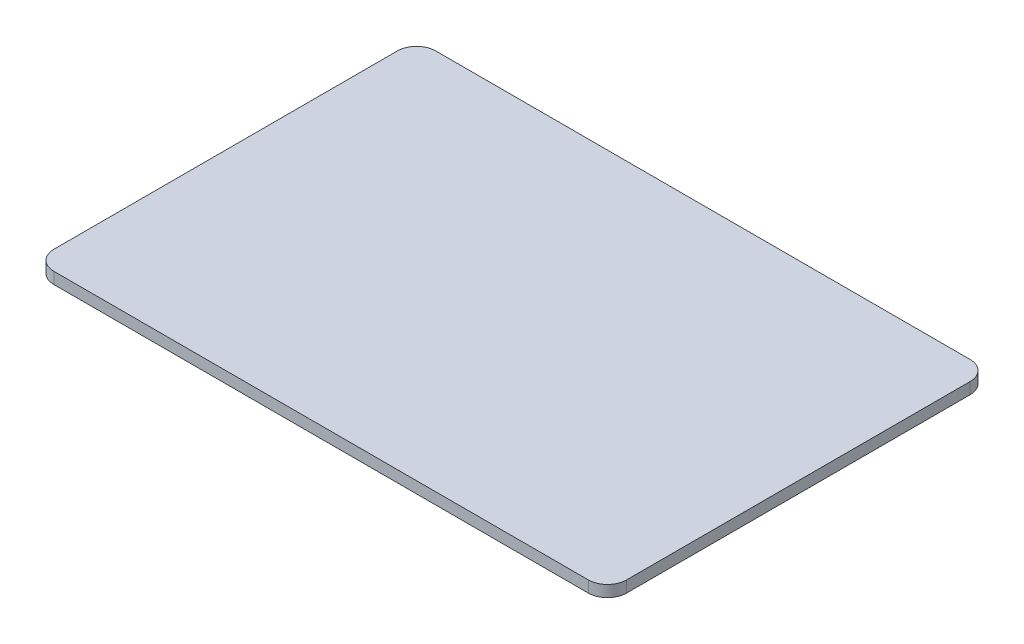
ISO-10303-21;
HEADER;
FILE_DESCRIPTION(('STEP AP214'),'2;1');
FILE_NAME('part.step','',(''),(''),'','','');
FILE_SCHEMA(('AUTOMOTIVE_DESIGN { 1 0 10303 214 1 1 1 1 }'));
ENDSEC;
DATA;
#1=APPLICATION_CONTEXT('core data for automotive mechanical design processes');
#2=APPLICATION_PROTOCOL_DEFINITION('international standard','automotive_design',2000,#1);
#3=PRODUCT_CONTEXT('',#1,'mechanical');
#4=PRODUCT('Part','Part','',(#3));
#5=PRODUCT_RELATED_PRODUCT_CATEGORY('part','',(#4));
#6=PRODUCT_DEFINITION_FORMATION('','',#4);
#7=PRODUCT_DEFINITION_CONTEXT('part definition',#1,'design');
#8=PRODUCT_DEFINITION('design','',#6,#7);
#9=PRODUCT_DEFINITION_SHAPE('','',#8);
#10=(LENGTH_UNIT() NAMED_UNIT(*) SI_UNIT(.MILLI.,.METRE.));
#11=(NAMED_UNIT(*) PLANE_ANGLE_UNIT() SI_UNIT($,.RADIAN.));
#12=(NAMED_UNIT(*) SI_UNIT($,.STERADIAN.) SOLID_ANGLE_UNIT());
#13=UNCERTAINTY_MEASURE_WITH_UNIT(LENGTH_MEASURE(1.E-05),#10,'distance_accuracy_value','');
#14=(GEOMETRIC_REPRESENTATION_CONTEXT(3) GLOBAL_UNCERTAINTY_ASSIGNED_CONTEXT((#13)) GLOBAL_UNIT_ASSIGNED_CONTEXT((#10,
#11,#12)) REPRESENTATION_CONTEXT('',''));
#15=CARTESIAN_POINT('',(0.,0.,0.));
#16=DIRECTION('',(0.,0.,1.));
#17=DIRECTION('',(1.,0.,0.));
#18=AXIS2_PLACEMENT_3D('',#15,#16,#17);
#19=CARTESIAN_POINT('',(95.25,-1.27,63.5));
#20=DIRECTION('',(1.,0.,0.));
#21=DIRECTION('',(0.,0.,-1.));
#22=AXIS2_PLACEMENT_3D('',#19,#20,#21);
#23=PLANE('',#22);
#24=DIRECTION('',(0.,0.,-1.));
#25=VECTOR('',#24,1.);
#26=CARTESIAN_POINT('',(95.25,-1.27,63.5));
#27=LINE('',#26,#25);
#28=CARTESIAN_POINT('',(95.25,-1.27,57.15));
#29=VERTEX_POINT('',#28);
#30=CARTESIAN_POINT('',(95.25,-1.27,-57.15));
#31=VERTEX_POINT('',#30);
#32=EDGE_CURVE('E165',#29,#31,#27,.T.);
#33=ORIENTED_EDGE('',*,*,#32,.T.);
#34=DIRECTION('',(0.,1.,0.));
#35=VECTOR('',#34,1.);
#36=CARTESIAN_POINT('',(95.25,-1.27,-57.15));
#37=LINE('',#36,#35);
#38=CARTESIAN_POINT('',(95.25,2.54,-57.15));
#39=VERTEX_POINT('',#38);
#40=EDGE_CURVE('E120',#31,#39,#37,.T.);
#41=ORIENTED_EDGE('',*,*,#40,.T.);
#42=DIRECTION('',(0.,0.,-1.));
#43=VECTOR('',#42,1.);
#44=CARTESIAN_POINT('',(95.25,2.54,63.5));
#45=LINE('',#44,#43);
#46=CARTESIAN_POINT('',(95.25,2.54,57.15));
#47=VERTEX_POINT('',#46);
#48=EDGE_CURVE('E104',#47,#39,#45,.T.);
#49=ORIENTED_EDGE('',*,*,#48,.F.);
#50=DIRECTION('',(0.,1.,0.));
#51=VECTOR('',#50,1.);
#52=CARTESIAN_POINT('',(95.25,-1.27,57.15));
#53=LINE('',#52,#51);
#54=EDGE_CURVE('E117',#47,#29,#53,.F.);
#55=ORIENTED_EDGE('',*,*,#54,.T.);
#56=EDGE_LOOP('',(#33,#41,#49,#55));
#57=FACE_BOUND('',#56,.T.);
#58=ADVANCED_FACE('F35',(#57),#23,.T.);
#59=CARTESIAN_POINT('',(-95.25,-1.27,63.5));
#60=DIRECTION('',(0.,0.,1.));
#61=DIRECTION('',(1.,0.,0.));
#62=AXIS2_PLACEMENT_3D('',#59,#60,#61);
#63=PLANE('',#62);
#64=DIRECTION('',(1.,0.,0.));
#65=VECTOR('',#64,1.);
#66=CARTESIAN_POINT('',(-95.25,-1.27,63.5));
#67=LINE('',#66,#65);
#68=CARTESIAN_POINT('',(-88.9,-1.27,63.5));
#69=VERTEX_POINT('',#68);
#70=CARTESIAN_POINT('',(88.9,-1.27,63.5));
#71=VERTEX_POINT('',#70);
#72=EDGE_CURVE('E126',#69,#71,#67,.T.);
#73=ORIENTED_EDGE('',*,*,#72,.T.);
#74=DIRECTION('',(0.,1.,0.));
#75=VECTOR('',#74,1.);
#76=CARTESIAN_POINT('',(88.9,-1.27,63.5));
#77=LINE('',#76,#75);
#78=CARTESIAN_POINT('',(88.9,2.54,63.5));
#79=VERTEX_POINT('',#78);
#80=EDGE_CURVE('E151',#71,#79,#77,.T.);
#81=ORIENTED_EDGE('',*,*,#80,.T.);
#82=DIRECTION('',(1.,0.,0.));
#83=VECTOR('',#82,1.);
#84=CARTESIAN_POINT('',(-95.25,2.54,63.5));
#85=LINE('',#84,#83);
#86=CARTESIAN_POINT('',(-88.9,2.54,63.5));
#87=VERTEX_POINT('',#86);
#88=EDGE_CURVE('E106',#87,#79,#85,.T.);
#89=ORIENTED_EDGE('',*,*,#88,.F.);
#90=DIRECTION('',(0.,1.,0.));
#91=VECTOR('',#90,1.);
#92=CARTESIAN_POINT('',(-88.9,-1.27,63.5));
#93=LINE('',#92,#91);
#94=EDGE_CURVE('E149',#87,#69,#93,.F.);
#95=ORIENTED_EDGE('',*,*,#94,.T.);
#96=EDGE_LOOP('',(#73,#81,#89,#95));
#97=FACE_BOUND('',#96,.T.);
#98=ADVANCED_FACE('F153',(#97),#63,.T.);
#99=CARTESIAN_POINT('',(-95.25,-1.27,63.5));
#100=DIRECTION('',(-1.,0.,0.));
#101=DIRECTION('',(0.,0.,1.));
#102=AXIS2_PLACEMENT_3D('',#99,#100,#101);
#103=PLANE('',#102);
#104=DIRECTION('',(0.,0.,1.));
#105=VECTOR('',#104,1.);
#106=CARTESIAN_POINT('',(-95.25,-1.27,63.5));
#107=LINE('',#106,#105);
#108=CARTESIAN_POINT('',(-95.25,-1.27,-57.15));
#109=VERTEX_POINT('',#108);
#110=CARTESIAN_POINT('',(-95.25,-1.27,57.15));
#111=VERTEX_POINT('',#110);
#112=EDGE_CURVE('E131',#109,#111,#107,.T.);
#113=ORIENTED_EDGE('',*,*,#112,.T.);
#114=DIRECTION('',(0.,1.,0.));
#115=VECTOR('',#114,1.);
#116=CARTESIAN_POINT('',(-95.25,-1.27,57.15));
#117=LINE('',#116,#115);
#118=CARTESIAN_POINT('',(-95.25,2.54,57.15));
#119=VERTEX_POINT('',#118);
#120=EDGE_CURVE('E11',#111,#119,#117,.T.);
#121=ORIENTED_EDGE('',*,*,#120,.T.);
#122=DIRECTION('',(0.,0.,1.));
#123=VECTOR('',#122,1.);
#124=CARTESIAN_POINT('',(-95.25,2.54,63.5));
#125=LINE('',#124,#123);
#126=CARTESIAN_POINT('',(-95.25,2.54,-57.15));
#127=VERTEX_POINT('',#126);
#128=EDGE_CURVE('E162',#127,#119,#125,.T.);
#129=ORIENTED_EDGE('',*,*,#128,.F.);
#130=DIRECTION('',(0.,1.,0.));
#131=VECTOR('',#130,1.);
#132=CARTESIAN_POINT('',(-95.25,-1.27,-57.15));
#133=LINE('',#132,#131);
#134=EDGE_CURVE('E43',#127,#109,#133,.F.);
#135=ORIENTED_EDGE('',*,*,#134,.T.);
#136=EDGE_LOOP('',(#113,#121,#129,#135));
#137=FACE_BOUND('',#136,.T.);
#138=ADVANCED_FACE('F161',(#137),#103,.T.);
#139=CARTESIAN_POINT('',(-95.25,-1.27,-63.5));
#140=DIRECTION('',(0.,0.,-1.));
#141=DIRECTION('',(-1.,0.,0.));
#142=AXIS2_PLACEMENT_3D('',#139,#140,#141);
#143=PLANE('',#142);
#144=DIRECTION('',(-1.,0.,0.));
#145=VECTOR('',#144,1.);
#146=CARTESIAN_POINT('',(-95.25,2.54,-63.5));
#147=LINE('',#146,#145);
#148=CARTESIAN_POINT('',(88.9,2.54,-63.5));
#149=VERTEX_POINT('',#148);
#150=CARTESIAN_POINT('',(-88.9,2.54,-63.5));
#151=VERTEX_POINT('',#150);
#152=EDGE_CURVE('E121',#149,#151,#147,.T.);
#153=ORIENTED_EDGE('',*,*,#152,.F.);
#154=DIRECTION('',(0.,1.,0.));
#155=VECTOR('',#154,1.);
#156=CARTESIAN_POINT('',(88.9,-1.27,-63.5));
#157=LINE('',#156,#155);
#158=CARTESIAN_POINT('',(88.9,-1.27,-63.5));
#159=VERTEX_POINT('',#158);
#160=EDGE_CURVE('E141',#149,#159,#157,.F.);
#161=ORIENTED_EDGE('',*,*,#160,.T.);
#162=DIRECTION('',(-1.,0.,0.));
#163=VECTOR('',#162,1.);
#164=CARTESIAN_POINT('',(-95.25,-1.27,-63.5));
#165=LINE('',#164,#163);
#166=CARTESIAN_POINT('',(-88.9,-1.27,-63.5));
#167=VERTEX_POINT('',#166);
#168=EDGE_CURVE('E170',#159,#167,#165,.T.);
#169=ORIENTED_EDGE('',*,*,#168,.T.);
#170=DIRECTION('',(0.,1.,0.));
#171=VECTOR('',#170,1.);
#172=CARTESIAN_POINT('',(-88.9,-1.27,-63.5));
#173=LINE('',#172,#171);
#174=EDGE_CURVE('E138',#167,#151,#173,.T.);
#175=ORIENTED_EDGE('',*,*,#174,.T.);
#176=EDGE_LOOP('',(#153,#161,#169,#175));
#177=FACE_BOUND('',#176,.T.);
#178=ADVANCED_FACE('F175',(#177),#143,.T.);
#179=CARTESIAN_POINT('',(0.,-1.27,0.));
#180=DIRECTION('',(0.,-1.,0.));
#181=DIRECTION('',(0.,0.,-1.));
#182=AXIS2_PLACEMENT_3D('',#179,#180,#181);
#183=PLANE('',#182);
#184=ORIENTED_EDGE('',*,*,#168,.F.);
#185=CARTESIAN_POINT('',(88.9,-1.27,-57.15));
#186=DIRECTION('',(0.,-1.,0.));
#187=DIRECTION('',(0.,0.,-1.));
#188=AXIS2_PLACEMENT_3D('',#185,#186,#187);
#189=CIRCLE('',#188,6.35);
#190=EDGE_CURVE('E147',#159,#31,#189,.T.);
#191=ORIENTED_EDGE('',*,*,#190,.T.);
#192=ORIENTED_EDGE('',*,*,#32,.F.);
#193=CARTESIAN_POINT('',(88.9,-1.27,57.15));
#194=DIRECTION('',(0.,-1.,0.));
#195=DIRECTION('',(0.,0.,-1.));
#196=AXIS2_PLACEMENT_3D('',#193,#194,#195);
#197=CIRCLE('',#196,6.35);
#198=EDGE_CURVE('E125',#29,#71,#197,.T.);
#199=ORIENTED_EDGE('',*,*,#198,.T.);
#200=ORIENTED_EDGE('',*,*,#72,.F.);
#201=CARTESIAN_POINT('',(-88.9,-1.27,57.15));
#202=DIRECTION('',(0.,-1.,0.));
#203=DIRECTION('',(0.,0.,-1.));
#204=AXIS2_PLACEMENT_3D('',#201,#202,#203);
#205=CIRCLE('',#204,6.35);
#206=EDGE_CURVE('E50',#69,#111,#205,.T.);
#207=ORIENTED_EDGE('',*,*,#206,.T.);
#208=ORIENTED_EDGE('',*,*,#112,.F.);
#209=CARTESIAN_POINT('',(-88.9,-1.27,-57.15));
#210=DIRECTION('',(0.,-1.,0.));
#211=DIRECTION('',(0.,0.,-1.));
#212=AXIS2_PLACEMENT_3D('',#209,#210,#211);
#213=CIRCLE('',#212,6.35);
#214=EDGE_CURVE('E143',#109,#167,#213,.T.);
#215=ORIENTED_EDGE('',*,*,#214,.T.);
#216=EDGE_LOOP('',(#184,#191,#192,#199,#200,#207,#208,#215));
#217=FACE_BOUND('',#216,.T.);
#218=ADVANCED_FACE('F156',(#217),#183,.T.);
#219=CARTESIAN_POINT('',(0.,2.54,0.));
#220=DIRECTION('',(0.,-1.,0.));
#221=DIRECTION('',(0.,0.,-1.));
#222=AXIS2_PLACEMENT_3D('',#219,#220,#221);
#223=PLANE('',#222);
#224=ORIENTED_EDGE('',*,*,#48,.T.);
#225=CARTESIAN_POINT('',(88.9,2.54,-57.15));
#226=DIRECTION('',(0.,-1.,0.));
#227=DIRECTION('',(0.,0.,-1.));
#228=AXIS2_PLACEMENT_3D('',#225,#226,#227);
#229=CIRCLE('',#228,6.35);
#230=EDGE_CURVE('E111',#39,#149,#229,.F.);
#231=ORIENTED_EDGE('',*,*,#230,.T.);
#232=ORIENTED_EDGE('',*,*,#152,.T.);
#233=CARTESIAN_POINT('',(-88.9,2.54,-57.15));
#234=DIRECTION('',(0.,-1.,0.));
#235=DIRECTION('',(0.,0.,-1.));
#236=AXIS2_PLACEMENT_3D('',#233,#234,#235);
#237=CIRCLE('',#236,6.35);
#238=EDGE_CURVE('E128',#151,#127,#237,.F.);
#239=ORIENTED_EDGE('',*,*,#238,.T.);
#240=ORIENTED_EDGE('',*,*,#128,.T.);
#241=CARTESIAN_POINT('',(-88.9,2.54,57.15));
#242=DIRECTION('',(0.,-1.,0.));
#243=DIRECTION('',(0.,0.,-1.));
#244=AXIS2_PLACEMENT_3D('',#241,#242,#243);
#245=CIRCLE('',#244,6.35);
#246=EDGE_CURVE('E112',#119,#87,#245,.F.);
#247=ORIENTED_EDGE('',*,*,#246,.T.);
#248=ORIENTED_EDGE('',*,*,#88,.T.);
#249=CARTESIAN_POINT('',(88.9,2.54,57.15));
#250=DIRECTION('',(0.,-1.,0.));
#251=DIRECTION('',(0.,0.,-1.));
#252=AXIS2_PLACEMENT_3D('',#249,#250,#251);
#253=CIRCLE('',#252,6.35);
#254=EDGE_CURVE('E101',#79,#47,#253,.F.);
#255=ORIENTED_EDGE('',*,*,#254,.T.);
#256=EDGE_LOOP('',(#224,#231,#232,#239,#240,#247,#248,#255));
#257=FACE_BOUND('',#256,.T.);
#258=ADVANCED_FACE('F103',(#257),#223,.F.);
#259=CARTESIAN_POINT('',(88.9,-1.27,-57.15));
#260=DIRECTION('',(0.,1.,0.));
#261=DIRECTION('',(0.,0.,1.));
#262=AXIS2_PLACEMENT_3D('',#259,#260,#261);
#263=CYLINDRICAL_SURFACE('',#262,6.35);
#264=ORIENTED_EDGE('',*,*,#190,.F.);
#265=ORIENTED_EDGE('',*,*,#160,.F.);
#266=ORIENTED_EDGE('',*,*,#230,.F.);
#267=ORIENTED_EDGE('',*,*,#40,.F.);
#268=EDGE_LOOP('',(#264,#265,#266,#267));
#269=FACE_BOUND('',#268,.T.);
#270=ADVANCED_FACE('F193',(#269),#263,.T.);
#271=CARTESIAN_POINT('',(88.9,-1.27,57.15));
#272=DIRECTION('',(0.,1.,0.));
#273=DIRECTION('',(0.,0.,1.));
#274=AXIS2_PLACEMENT_3D('',#271,#272,#273);
#275=CYLINDRICAL_SURFACE('',#274,6.35);
#276=ORIENTED_EDGE('',*,*,#198,.F.);
#277=ORIENTED_EDGE('',*,*,#54,.F.);
#278=ORIENTED_EDGE('',*,*,#254,.F.);
#279=ORIENTED_EDGE('',*,*,#80,.F.);
#280=EDGE_LOOP('',(#276,#277,#278,#279));
#281=FACE_BOUND('',#280,.T.);
#282=ADVANCED_FACE('F124',(#281),#275,.T.);
#283=CARTESIAN_POINT('',(-88.9,-1.27,57.15));
#284=DIRECTION('',(0.,1.,0.));
#285=DIRECTION('',(0.,0.,1.));
#286=AXIS2_PLACEMENT_3D('',#283,#284,#285);
#287=CYLINDRICAL_SURFACE('',#286,6.35);
#288=ORIENTED_EDGE('',*,*,#206,.F.);
#289=ORIENTED_EDGE('',*,*,#94,.F.);
#290=ORIENTED_EDGE('',*,*,#246,.F.);
#291=ORIENTED_EDGE('',*,*,#120,.F.);
#292=EDGE_LOOP('',(#288,#289,#290,#291));
#293=FACE_BOUND('',#292,.T.);
#294=ADVANCED_FACE('F159',(#293),#287,.T.);
#295=CARTESIAN_POINT('',(-88.9,-1.27,-57.15));
#296=DIRECTION('',(0.,1.,0.));
#297=DIRECTION('',(0.,0.,1.));
#298=AXIS2_PLACEMENT_3D('',#295,#296,#297);
#299=CYLINDRICAL_SURFACE('',#298,6.35);
#300=ORIENTED_EDGE('',*,*,#214,.F.);
#301=ORIENTED_EDGE('',*,*,#134,.F.);
#302=ORIENTED_EDGE('',*,*,#238,.F.);
#303=ORIENTED_EDGE('',*,*,#174,.F.);
#304=EDGE_LOOP('',(#300,#301,#302,#303));
#305=FACE_BOUND('',#304,.T.);
#306=ADVANCED_FACE('F37',(#305),#299,.T.);
#307=CLOSED_SHELL('',(#58,#98,#138,#178,#218,#258,#270,#282,#294,#306));
#308=MANIFOLD_SOLID_BREP('B2',#307);
#309=ADVANCED_BREP_SHAPE_REPRESENTATION('',(#18,#308),#14);
#310=SHAPE_DEFINITION_REPRESENTATION(#9,#309);
ENDSEC;
END-ISO-10303-21;
